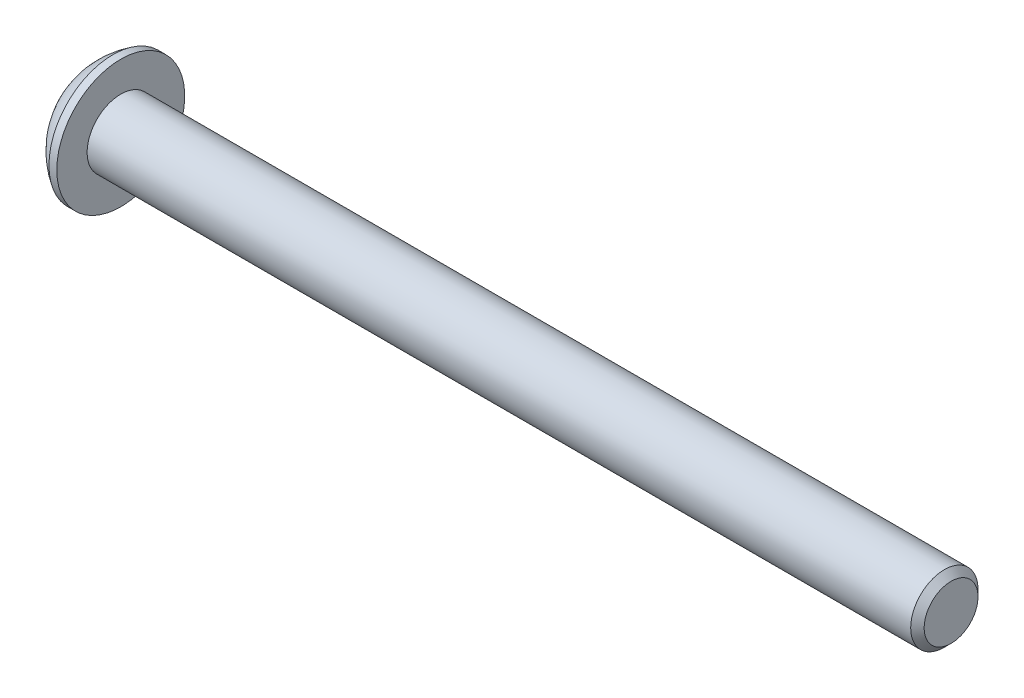
ISO-10303-21;
HEADER;
FILE_DESCRIPTION(('STEP AP214'),'2;1');
FILE_NAME('part.step','',(''),(''),'','','');
FILE_SCHEMA(('AUTOMOTIVE_DESIGN { 1 0 10303 214 1 1 1 1 }'));
ENDSEC;
DATA;
#1=APPLICATION_CONTEXT('core data for automotive mechanical design processes');
#2=APPLICATION_PROTOCOL_DEFINITION('international standard','automotive_design',2000,#1);
#3=PRODUCT_CONTEXT('',#1,'mechanical');
#4=PRODUCT('Part','Part','',(#3));
#5=PRODUCT_RELATED_PRODUCT_CATEGORY('part','',(#4));
#6=PRODUCT_DEFINITION_FORMATION('','',#4);
#7=PRODUCT_DEFINITION_CONTEXT('part definition',#1,'design');
#8=PRODUCT_DEFINITION('design','',#6,#7);
#9=PRODUCT_DEFINITION_SHAPE('','',#8);
#10=(LENGTH_UNIT() NAMED_UNIT(*) SI_UNIT(.MILLI.,.METRE.));
#11=(NAMED_UNIT(*) PLANE_ANGLE_UNIT() SI_UNIT($,.RADIAN.));
#12=(NAMED_UNIT(*) SI_UNIT($,.STERADIAN.) SOLID_ANGLE_UNIT());
#13=UNCERTAINTY_MEASURE_WITH_UNIT(LENGTH_MEASURE(1.E-05),#10,'distance_accuracy_value','');
#14=(GEOMETRIC_REPRESENTATION_CONTEXT(3) GLOBAL_UNCERTAINTY_ASSIGNED_CONTEXT((#13)) GLOBAL_UNIT_ASSIGNED_CONTEXT((#10,
#11,#12)) REPRESENTATION_CONTEXT('',''));
#15=CARTESIAN_POINT('',(0.,0.,0.));
#16=DIRECTION('',(0.,0.,1.));
#17=DIRECTION('',(1.,0.,0.));
#18=AXIS2_PLACEMENT_3D('',#15,#16,#17);
#19=CARTESIAN_POINT('',(0.,0.,0.));
#20=DIRECTION('',(1.,0.,0.));
#21=DIRECTION('',(0.,0.,-1.));
#22=AXIS2_PLACEMENT_3D('',#19,#20,#21);
#23=PLANE('',#22);
#24=DIRECTION('',(0.,-0.5,-0.866025403784439));
#25=VECTOR('',#24,1.);
#26=CARTESIAN_POINT('',(0.,1.15470053837925,0.));
#27=LINE('',#26,#25);
#28=CARTESIAN_POINT('',(0.,1.15470053837925,0.));
#29=VERTEX_POINT('',#28);
#30=CARTESIAN_POINT('',(0.,0.577350269189626,-1.));
#31=VERTEX_POINT('',#30);
#32=EDGE_CURVE('E142',#29,#31,#27,.T.);
#33=ORIENTED_EDGE('',*,*,#32,.F.);
#34=DIRECTION('',(0.,0.5,-0.866025403784439));
#35=VECTOR('',#34,1.);
#36=CARTESIAN_POINT('',(0.,0.577350269189626,1.));
#37=LINE('',#36,#35);
#38=CARTESIAN_POINT('',(0.,0.577350269189626,1.));
#39=VERTEX_POINT('',#38);
#40=EDGE_CURVE('E62',#39,#29,#37,.T.);
#41=ORIENTED_EDGE('',*,*,#40,.F.);
#42=DIRECTION('',(0.,1.,0.));
#43=VECTOR('',#42,1.);
#44=CARTESIAN_POINT('',(0.,-0.577350269189626,1.));
#45=LINE('',#44,#43);
#46=CARTESIAN_POINT('',(0.,-0.577350269189626,1.));
#47=VERTEX_POINT('',#46);
#48=EDGE_CURVE('E155',#47,#39,#45,.T.);
#49=ORIENTED_EDGE('',*,*,#48,.F.);
#50=DIRECTION('',(0.,0.5,0.866025403784439));
#51=VECTOR('',#50,1.);
#52=CARTESIAN_POINT('',(0.,-1.15470053837925,0.));
#53=LINE('',#52,#51);
#54=CARTESIAN_POINT('',(0.,-1.15470053837925,0.));
#55=VERTEX_POINT('',#54);
#56=EDGE_CURVE('E152',#55,#47,#53,.T.);
#57=ORIENTED_EDGE('',*,*,#56,.F.);
#58=DIRECTION('',(0.,-0.5,0.866025403784438));
#59=VECTOR('',#58,1.);
#60=CARTESIAN_POINT('',(0.,-0.577350269189626,-1.));
#61=LINE('',#60,#59);
#62=CARTESIAN_POINT('',(0.,-0.577350269189626,-1.));
#63=VERTEX_POINT('',#62);
#64=EDGE_CURVE('E110',#63,#55,#61,.T.);
#65=ORIENTED_EDGE('',*,*,#64,.F.);
#66=DIRECTION('',(0.,-1.,0.));
#67=VECTOR('',#66,1.);
#68=CARTESIAN_POINT('',(0.,0.577350269189626,-1.));
#69=LINE('',#68,#67);
#70=EDGE_CURVE('E146',#31,#63,#69,.T.);
#71=ORIENTED_EDGE('',*,*,#70,.F.);
#72=EDGE_LOOP('',(#33,#41,#49,#57,#65,#71));
#73=FACE_BOUND('',#72,.T.);
#74=CARTESIAN_POINT('',(0.,0.,0.));
#75=DIRECTION('',(-1.,0.,0.));
#76=DIRECTION('',(0.,0.,1.));
#77=AXIS2_PLACEMENT_3D('',#74,#75,#76);
#78=CIRCLE('',#77,1.43);
#79=CARTESIAN_POINT('',(0.,0.,1.43));
#80=VERTEX_POINT('',#79);
#81=EDGE_CURVE('E182',#80,#80,#78,.T.);
#82=ORIENTED_EDGE('',*,*,#81,.T.);
#83=EDGE_LOOP('',(#82));
#84=FACE_BOUND('',#83,.T.);
#85=ADVANCED_FACE('F45',(#73,#84),#23,.F.);
#86=CARTESIAN_POINT('',(3.13199341721866,0.,0.));
#87=DIRECTION('',(-1.,0.,0.));
#88=DIRECTION('',(0.,0.,1.));
#89=AXIS2_PLACEMENT_3D('',#86,#87,#88);
#90=DEGENERATE_TOROIDAL_SURFACE('',#89,0.132247494636803,3.5,.F.);
#91=ORIENTED_EDGE('',*,*,#81,.F.);
#92=EDGE_LOOP('',(#91));
#93=FACE_BOUND('',#92,.T.);
#94=CARTESIAN_POINT('',(1.3,0.,0.));
#95=DIRECTION('',(-1.,0.,0.));
#96=DIRECTION('',(0.,0.,1.));
#97=AXIS2_PLACEMENT_3D('',#94,#95,#96);
#98=CIRCLE('',#97,2.85);
#99=CARTESIAN_POINT('',(1.3,0.,2.85));
#100=VERTEX_POINT('',#99);
#101=EDGE_CURVE('E178',#100,#100,#98,.T.);
#102=ORIENTED_EDGE('',*,*,#101,.T.);
#103=EDGE_LOOP('',(#102));
#104=FACE_BOUND('',#103,.T.);
#105=ADVANCED_FACE('F206',(#93,#104),#90,.F.);
#106=CARTESIAN_POINT('',(0.,0.,0.));
#107=DIRECTION('',(-1.,0.,0.));
#108=DIRECTION('',(0.,0.,1.));
#109=AXIS2_PLACEMENT_3D('',#106,#107,#108);
#110=CYLINDRICAL_SURFACE('',#109,2.85);
#111=ORIENTED_EDGE('',*,*,#101,.F.);
#112=EDGE_LOOP('',(#111));
#113=FACE_BOUND('',#112,.T.);
#114=CARTESIAN_POINT('',(1.65,0.,0.));
#115=DIRECTION('',(-1.,0.,0.));
#116=DIRECTION('',(0.,0.,1.));
#117=AXIS2_PLACEMENT_3D('',#114,#115,#116);
#118=CIRCLE('',#117,2.85);
#119=CARTESIAN_POINT('',(1.65,0.,2.85));
#120=VERTEX_POINT('',#119);
#121=EDGE_CURVE('E174',#120,#120,#118,.T.);
#122=ORIENTED_EDGE('',*,*,#121,.T.);
#123=EDGE_LOOP('',(#122));
#124=FACE_BOUND('',#123,.T.);
#125=ADVANCED_FACE('F211',(#113,#124),#110,.T.);
#126=CARTESIAN_POINT('',(1.65,2.85,0.));
#127=DIRECTION('',(-1.,0.,0.));
#128=DIRECTION('',(0.,0.,1.));
#129=AXIS2_PLACEMENT_3D('',#126,#127,#128);
#130=PLANE('',#129);
#131=ORIENTED_EDGE('',*,*,#121,.F.);
#132=EDGE_LOOP('',(#131));
#133=FACE_BOUND('',#132,.T.);
#134=CARTESIAN_POINT('',(1.65,0.,0.));
#135=DIRECTION('',(-1.,0.,0.));
#136=DIRECTION('',(0.,0.,1.));
#137=AXIS2_PLACEMENT_3D('',#134,#135,#136);
#138=CIRCLE('',#137,1.5);
#139=CARTESIAN_POINT('',(1.65,0.,1.5));
#140=VERTEX_POINT('',#139);
#141=EDGE_CURVE('E161',#140,#140,#138,.T.);
#142=ORIENTED_EDGE('',*,*,#141,.T.);
#143=EDGE_LOOP('',(#142));
#144=FACE_BOUND('',#143,.T.);
#145=ADVANCED_FACE('F219',(#133,#144),#130,.F.);
#146=CARTESIAN_POINT('',(0.,0.,0.));
#147=DIRECTION('',(-1.,0.,0.));
#148=DIRECTION('',(0.,0.,1.));
#149=AXIS2_PLACEMENT_3D('',#146,#147,#148);
#150=CYLINDRICAL_SURFACE('',#149,1.5);
#151=CARTESIAN_POINT('',(38.35,0.,0.));
#152=DIRECTION('',(-1.,0.,0.));
#153=DIRECTION('',(0.,0.,1.));
#154=AXIS2_PLACEMENT_3D('',#151,#152,#153);
#155=CIRCLE('',#154,1.5);
#156=CARTESIAN_POINT('',(38.35,0.,1.5));
#157=VERTEX_POINT('',#156);
#158=EDGE_CURVE('E55',#157,#157,#155,.T.);
#159=ORIENTED_EDGE('',*,*,#158,.T.);
#160=EDGE_LOOP('',(#159));
#161=FACE_BOUND('',#160,.T.);
#162=ORIENTED_EDGE('',*,*,#141,.F.);
#163=EDGE_LOOP('',(#162));
#164=FACE_BOUND('',#163,.T.);
#165=ADVANCED_FACE('F189',(#161,#164),#150,.T.);
#166=CARTESIAN_POINT('',(38.65,1.5,0.));
#167=DIRECTION('',(-1.,0.,0.));
#168=DIRECTION('',(0.,0.,1.));
#169=AXIS2_PLACEMENT_3D('',#166,#167,#168);
#170=PLANE('',#169);
#171=CARTESIAN_POINT('',(38.65,0.,0.));
#172=DIRECTION('',(-1.,0.,0.));
#173=DIRECTION('',(0.,0.,1.));
#174=AXIS2_PLACEMENT_3D('',#171,#172,#173);
#175=CIRCLE('',#174,1.2);
#176=CARTESIAN_POINT('',(38.65,0.,1.2));
#177=VERTEX_POINT('',#176);
#178=EDGE_CURVE('E11',#177,#177,#175,.F.);
#179=ORIENTED_EDGE('',*,*,#178,.T.);
#180=EDGE_LOOP('',(#179));
#181=FACE_BOUND('',#180,.T.);
#182=ADVANCED_FACE('F194',(#181),#170,.F.);
#183=CARTESIAN_POINT('',(38.35,0.,0.));
#184=DIRECTION('',(-1.,0.,0.));
#185=DIRECTION('',(0.,0.,1.));
#186=AXIS2_PLACEMENT_3D('',#183,#184,#185);
#187=CONICAL_SURFACE('',#186,1.5,0.785398163397452);
#188=ORIENTED_EDGE('',*,*,#178,.F.);
#189=EDGE_LOOP('',(#188));
#190=FACE_BOUND('',#189,.T.);
#191=ORIENTED_EDGE('',*,*,#158,.F.);
#192=EDGE_LOOP('',(#191));
#193=FACE_BOUND('',#192,.T.);
#194=ADVANCED_FACE('F48',(#190,#193),#187,.T.);
#195=CARTESIAN_POINT('',(1.,0.577350269189626,1.));
#196=DIRECTION('',(0.,0.866025403784439,0.5));
#197=DIRECTION('',(0.,-0.5,0.866025403784439));
#198=AXIS2_PLACEMENT_3D('',#195,#196,#197);
#199=PLANE('',#198);
#200=ORIENTED_EDGE('',*,*,#40,.T.);
#201=DIRECTION('',(-1.,0.,0.));
#202=VECTOR('',#201,1.);
#203=CARTESIAN_POINT('',(1.,1.15470053837925,0.));
#204=LINE('',#203,#202);
#205=CARTESIAN_POINT('',(1.,1.15470053837925,0.));
#206=VERTEX_POINT('',#205);
#207=EDGE_CURVE('E92',#206,#29,#204,.T.);
#208=ORIENTED_EDGE('',*,*,#207,.F.);
#209=DIRECTION('',(0.,0.5,-0.866025403784439));
#210=VECTOR('',#209,1.);
#211=CARTESIAN_POINT('',(1.,0.577350269189626,1.));
#212=LINE('',#211,#210);
#213=CARTESIAN_POINT('',(1.,0.577350269189626,1.));
#214=VERTEX_POINT('',#213);
#215=EDGE_CURVE('E158',#214,#206,#212,.T.);
#216=ORIENTED_EDGE('',*,*,#215,.F.);
#217=DIRECTION('',(-1.,0.,0.));
#218=VECTOR('',#217,1.);
#219=CARTESIAN_POINT('',(1.,0.577350269189626,1.));
#220=LINE('',#219,#218);
#221=EDGE_CURVE('E70',#214,#39,#220,.T.);
#222=ORIENTED_EDGE('',*,*,#221,.T.);
#223=EDGE_LOOP('',(#200,#208,#216,#222));
#224=FACE_BOUND('',#223,.T.);
#225=ADVANCED_FACE('F193',(#224),#199,.F.);
#226=CARTESIAN_POINT('',(1.,-0.577350269189626,1.));
#227=DIRECTION('',(0.,0.,1.));
#228=DIRECTION('',(0.,-1.,0.));
#229=AXIS2_PLACEMENT_3D('',#226,#227,#228);
#230=PLANE('',#229);
#231=ORIENTED_EDGE('',*,*,#48,.T.);
#232=ORIENTED_EDGE('',*,*,#221,.F.);
#233=DIRECTION('',(0.,1.,0.));
#234=VECTOR('',#233,1.);
#235=CARTESIAN_POINT('',(1.,-0.577350269189626,1.));
#236=LINE('',#235,#234);
#237=CARTESIAN_POINT('',(1.,-0.577350269189626,1.));
#238=VERTEX_POINT('',#237);
#239=EDGE_CURVE('E124',#238,#214,#236,.T.);
#240=ORIENTED_EDGE('',*,*,#239,.F.);
#241=DIRECTION('',(-1.,0.,0.));
#242=VECTOR('',#241,1.);
#243=CARTESIAN_POINT('',(1.,-0.577350269189626,1.));
#244=LINE('',#243,#242);
#245=EDGE_CURVE('E115',#238,#47,#244,.T.);
#246=ORIENTED_EDGE('',*,*,#245,.T.);
#247=EDGE_LOOP('',(#231,#232,#240,#246));
#248=FACE_BOUND('',#247,.T.);
#249=ADVANCED_FACE('F200',(#248),#230,.F.);
#250=CARTESIAN_POINT('',(1.,-1.15470053837925,0.));
#251=DIRECTION('',(0.,-0.866025403784439,0.5));
#252=DIRECTION('',(0.,-0.5,-0.866025403784439));
#253=AXIS2_PLACEMENT_3D('',#250,#251,#252);
#254=PLANE('',#253);
#255=ORIENTED_EDGE('',*,*,#56,.T.);
#256=ORIENTED_EDGE('',*,*,#245,.F.);
#257=DIRECTION('',(0.,0.5,0.866025403784439));
#258=VECTOR('',#257,1.);
#259=CARTESIAN_POINT('',(1.,-1.15470053837925,0.));
#260=LINE('',#259,#258);
#261=CARTESIAN_POINT('',(1.,-1.15470053837925,0.));
#262=VERTEX_POINT('',#261);
#263=EDGE_CURVE('E119',#262,#238,#260,.T.);
#264=ORIENTED_EDGE('',*,*,#263,.F.);
#265=DIRECTION('',(-1.,0.,0.));
#266=VECTOR('',#265,1.);
#267=CARTESIAN_POINT('',(1.,-1.15470053837925,0.));
#268=LINE('',#267,#266);
#269=EDGE_CURVE('E103',#262,#55,#268,.T.);
#270=ORIENTED_EDGE('',*,*,#269,.T.);
#271=EDGE_LOOP('',(#255,#256,#264,#270));
#272=FACE_BOUND('',#271,.T.);
#273=ADVANCED_FACE('F120',(#272),#254,.F.);
#274=CARTESIAN_POINT('',(1.,-0.577350269189626,-1.));
#275=DIRECTION('',(0.,-0.866025403784439,-0.5));
#276=DIRECTION('',(0.,0.5,-0.866025403784439));
#277=AXIS2_PLACEMENT_3D('',#274,#275,#276);
#278=PLANE('',#277);
#279=ORIENTED_EDGE('',*,*,#64,.T.);
#280=ORIENTED_EDGE('',*,*,#269,.F.);
#281=DIRECTION('',(0.,-0.5,0.866025403784438));
#282=VECTOR('',#281,1.);
#283=CARTESIAN_POINT('',(1.,-0.577350269189626,-1.));
#284=LINE('',#283,#282);
#285=CARTESIAN_POINT('',(1.,-0.577350269189626,-1.));
#286=VERTEX_POINT('',#285);
#287=EDGE_CURVE('E107',#286,#262,#284,.T.);
#288=ORIENTED_EDGE('',*,*,#287,.F.);
#289=DIRECTION('',(-1.,0.,0.));
#290=VECTOR('',#289,1.);
#291=CARTESIAN_POINT('',(1.,-0.577350269189626,-1.));
#292=LINE('',#291,#290);
#293=EDGE_CURVE('E116',#286,#63,#292,.T.);
#294=ORIENTED_EDGE('',*,*,#293,.T.);
#295=EDGE_LOOP('',(#279,#280,#288,#294));
#296=FACE_BOUND('',#295,.T.);
#297=ADVANCED_FACE('F105',(#296),#278,.F.);
#298=CARTESIAN_POINT('',(1.,0.577350269189626,-1.));
#299=DIRECTION('',(0.,0.,-1.));
#300=DIRECTION('',(0.,1.,0.));
#301=AXIS2_PLACEMENT_3D('',#298,#299,#300);
#302=PLANE('',#301);
#303=ORIENTED_EDGE('',*,*,#70,.T.);
#304=ORIENTED_EDGE('',*,*,#293,.F.);
#305=DIRECTION('',(0.,-1.,0.));
#306=VECTOR('',#305,1.);
#307=CARTESIAN_POINT('',(1.,0.577350269189626,-1.));
#308=LINE('',#307,#306);
#309=CARTESIAN_POINT('',(1.,0.577350269189626,-1.));
#310=VERTEX_POINT('',#309);
#311=EDGE_CURVE('E130',#310,#286,#308,.T.);
#312=ORIENTED_EDGE('',*,*,#311,.F.);
#313=DIRECTION('',(-1.,0.,0.));
#314=VECTOR('',#313,1.);
#315=CARTESIAN_POINT('',(1.,0.577350269189626,-1.));
#316=LINE('',#315,#314);
#317=EDGE_CURVE('E166',#310,#31,#316,.T.);
#318=ORIENTED_EDGE('',*,*,#317,.T.);
#319=EDGE_LOOP('',(#303,#304,#312,#318));
#320=FACE_BOUND('',#319,.T.);
#321=ADVANCED_FACE('F229',(#320),#302,.F.);
#322=CARTESIAN_POINT('',(1.,1.15470053837925,0.));
#323=DIRECTION('',(0.,0.866025403784439,-0.5));
#324=DIRECTION('',(0.,0.5,0.866025403784439));
#325=AXIS2_PLACEMENT_3D('',#322,#323,#324);
#326=PLANE('',#325);
#327=ORIENTED_EDGE('',*,*,#32,.T.);
#328=ORIENTED_EDGE('',*,*,#317,.F.);
#329=DIRECTION('',(0.,-0.5,-0.866025403784439));
#330=VECTOR('',#329,1.);
#331=CARTESIAN_POINT('',(1.,1.15470053837925,0.));
#332=LINE('',#331,#330);
#333=EDGE_CURVE('E134',#206,#310,#332,.T.);
#334=ORIENTED_EDGE('',*,*,#333,.F.);
#335=ORIENTED_EDGE('',*,*,#207,.T.);
#336=EDGE_LOOP('',(#327,#328,#334,#335));
#337=FACE_BOUND('',#336,.T.);
#338=ADVANCED_FACE('F226',(#337),#326,.F.);
#339=CARTESIAN_POINT('',(1.,0.,0.));
#340=DIRECTION('',(-1.,0.,0.));
#341=DIRECTION('',(0.,0.,1.));
#342=AXIS2_PLACEMENT_3D('',#339,#340,#341);
#343=PLANE('',#342);
#344=ORIENTED_EDGE('',*,*,#215,.T.);
#345=ORIENTED_EDGE('',*,*,#333,.T.);
#346=ORIENTED_EDGE('',*,*,#311,.T.);
#347=ORIENTED_EDGE('',*,*,#287,.T.);
#348=ORIENTED_EDGE('',*,*,#263,.T.);
#349=ORIENTED_EDGE('',*,*,#239,.T.);
#350=EDGE_LOOP('',(#344,#345,#346,#347,#348,#349));
#351=FACE_BOUND('',#350,.T.);
#352=ADVANCED_FACE('F127',(#351),#343,.T.);
#353=CLOSED_SHELL('',(#85,#105,#125,#145,#165,#182,#194,#225,#249,#273,#297,#321,#338,#352));
#354=MANIFOLD_SOLID_BREP('B2',#353);
#355=ADVANCED_BREP_SHAPE_REPRESENTATION('',(#18,#354),#14);
#356=SHAPE_DEFINITION_REPRESENTATION(#9,#355);
ENDSEC;
END-ISO-10303-21;
